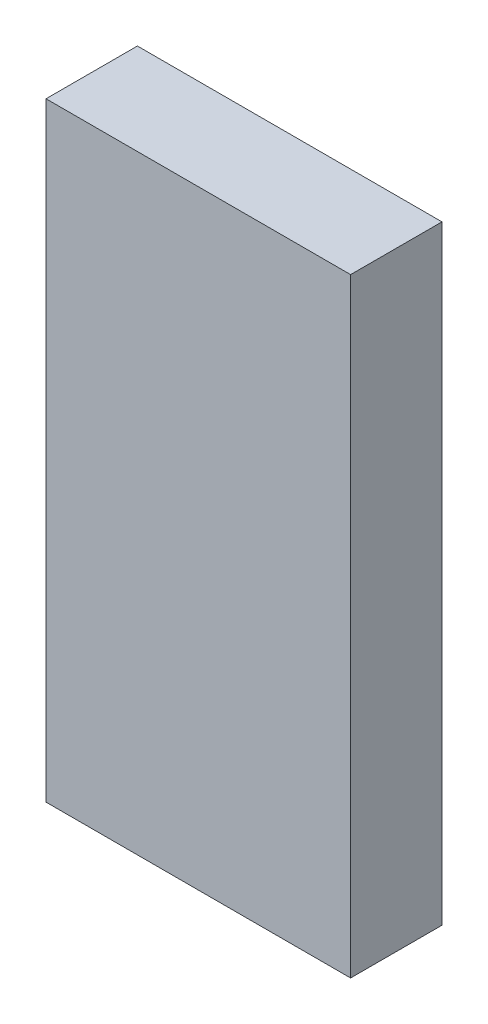
ISO-10303-21;
HEADER;
FILE_DESCRIPTION(('STEP AP214'),'2;1');
FILE_NAME('part.step','',(''),(''),'','','');
FILE_SCHEMA(('AUTOMOTIVE_DESIGN { 1 0 10303 214 1 1 1 1 }'));
ENDSEC;
DATA;
#1=APPLICATION_CONTEXT('core data for automotive mechanical design processes');
#2=APPLICATION_PROTOCOL_DEFINITION('international standard','automotive_design',2000,#1);
#3=PRODUCT_CONTEXT('',#1,'mechanical');
#4=PRODUCT('Part','Part','',(#3));
#5=PRODUCT_RELATED_PRODUCT_CATEGORY('part','',(#4));
#6=PRODUCT_DEFINITION_FORMATION('','',#4);
#7=PRODUCT_DEFINITION_CONTEXT('part definition',#1,'design');
#8=PRODUCT_DEFINITION('design','',#6,#7);
#9=PRODUCT_DEFINITION_SHAPE('','',#8);
#10=(LENGTH_UNIT() NAMED_UNIT(*) SI_UNIT(.MILLI.,.METRE.));
#11=(NAMED_UNIT(*) PLANE_ANGLE_UNIT() SI_UNIT($,.RADIAN.));
#12=(NAMED_UNIT(*) SI_UNIT($,.STERADIAN.) SOLID_ANGLE_UNIT());
#13=UNCERTAINTY_MEASURE_WITH_UNIT(LENGTH_MEASURE(1.E-05),#10,'distance_accuracy_value','');
#14=(GEOMETRIC_REPRESENTATION_CONTEXT(3) GLOBAL_UNCERTAINTY_ASSIGNED_CONTEXT((#13)) GLOBAL_UNIT_ASSIGNED_CONTEXT((#10,
#11,#12)) REPRESENTATION_CONTEXT('',''));
#15=CARTESIAN_POINT('',(0.,0.,0.));
#16=DIRECTION('',(0.,0.,1.));
#17=DIRECTION('',(1.,0.,0.));
#18=AXIS2_PLACEMENT_3D('',#15,#16,#17);
#19=CARTESIAN_POINT('',(-5.,20.,1.5));
#20=DIRECTION('',(1.,0.,0.));
#21=DIRECTION('',(0.,0.,-1.));
#22=AXIS2_PLACEMENT_3D('',#19,#20,#21);
#23=PLANE('',#22);
#24=DIRECTION('',(0.,0.,1.));
#25=VECTOR('',#24,1.);
#26=CARTESIAN_POINT('',(-5.,0.,1.5));
#27=LINE('',#26,#25);
#28=CARTESIAN_POINT('',(-5.,0.,-1.5));
#29=VERTEX_POINT('',#28);
#30=CARTESIAN_POINT('',(-5.,0.,1.5));
#31=VERTEX_POINT('',#30);
#32=EDGE_CURVE('E96',#29,#31,#27,.T.);
#33=ORIENTED_EDGE('',*,*,#32,.T.);
#34=DIRECTION('',(0.,-1.,0.));
#35=VECTOR('',#34,1.);
#36=CARTESIAN_POINT('',(-5.,20.,1.5));
#37=LINE('',#36,#35);
#38=CARTESIAN_POINT('',(-5.,20.,1.5));
#39=VERTEX_POINT('',#38);
#40=EDGE_CURVE('E11',#39,#31,#37,.T.);
#41=ORIENTED_EDGE('',*,*,#40,.F.);
#42=DIRECTION('',(0.,0.,1.));
#43=VECTOR('',#42,1.);
#44=CARTESIAN_POINT('',(-5.,20.,1.5));
#45=LINE('',#44,#43);
#46=CARTESIAN_POINT('',(-5.,20.,-1.5));
#47=VERTEX_POINT('',#46);
#48=EDGE_CURVE('E84',#47,#39,#45,.T.);
#49=ORIENTED_EDGE('',*,*,#48,.F.);
#50=DIRECTION('',(0.,-1.,0.));
#51=VECTOR('',#50,1.);
#52=CARTESIAN_POINT('',(-5.,20.,-1.5));
#53=LINE('',#52,#51);
#54=EDGE_CURVE('E92',#47,#29,#53,.T.);
#55=ORIENTED_EDGE('',*,*,#54,.T.);
#56=EDGE_LOOP('',(#33,#41,#49,#55));
#57=FACE_BOUND('',#56,.T.);
#58=ADVANCED_FACE('F33',(#57),#23,.F.);
#59=CARTESIAN_POINT('',(5.,20.,1.5));
#60=DIRECTION('',(0.,0.,-1.));
#61=DIRECTION('',(-1.,0.,0.));
#62=AXIS2_PLACEMENT_3D('',#59,#60,#61);
#63=PLANE('',#62);
#64=DIRECTION('',(1.,0.,0.));
#65=VECTOR('',#64,1.);
#66=CARTESIAN_POINT('',(5.,0.,1.5));
#67=LINE('',#66,#65);
#68=CARTESIAN_POINT('',(5.,0.,1.5));
#69=VERTEX_POINT('',#68);
#70=EDGE_CURVE('E88',#31,#69,#67,.T.);
#71=ORIENTED_EDGE('',*,*,#70,.T.);
#72=DIRECTION('',(0.,-1.,0.));
#73=VECTOR('',#72,1.);
#74=CARTESIAN_POINT('',(5.,20.,1.5));
#75=LINE('',#74,#73);
#76=CARTESIAN_POINT('',(5.,20.,1.5));
#77=VERTEX_POINT('',#76);
#78=EDGE_CURVE('E41',#77,#69,#75,.T.);
#79=ORIENTED_EDGE('',*,*,#78,.F.);
#80=DIRECTION('',(1.,0.,0.));
#81=VECTOR('',#80,1.);
#82=CARTESIAN_POINT('',(5.,20.,1.5));
#83=LINE('',#82,#81);
#84=EDGE_CURVE('E79',#39,#77,#83,.T.);
#85=ORIENTED_EDGE('',*,*,#84,.F.);
#86=ORIENTED_EDGE('',*,*,#40,.T.);
#87=EDGE_LOOP('',(#71,#79,#85,#86));
#88=FACE_BOUND('',#87,.T.);
#89=ADVANCED_FACE('F87',(#88),#63,.F.);
#90=CARTESIAN_POINT('',(5.,20.,1.5));
#91=DIRECTION('',(-1.,0.,0.));
#92=DIRECTION('',(0.,0.,1.));
#93=AXIS2_PLACEMENT_3D('',#90,#91,#92);
#94=PLANE('',#93);
#95=DIRECTION('',(0.,0.,-1.));
#96=VECTOR('',#95,1.);
#97=CARTESIAN_POINT('',(5.,0.,1.5));
#98=LINE('',#97,#96);
#99=CARTESIAN_POINT('',(5.,0.,-1.5));
#100=VERTEX_POINT('',#99);
#101=EDGE_CURVE('E66',#69,#100,#98,.T.);
#102=ORIENTED_EDGE('',*,*,#101,.T.);
#103=DIRECTION('',(0.,-1.,0.));
#104=VECTOR('',#103,1.);
#105=CARTESIAN_POINT('',(5.,20.,-1.5));
#106=LINE('',#105,#104);
#107=CARTESIAN_POINT('',(5.,20.,-1.5));
#108=VERTEX_POINT('',#107);
#109=EDGE_CURVE('E89',#108,#100,#106,.T.);
#110=ORIENTED_EDGE('',*,*,#109,.F.);
#111=DIRECTION('',(0.,0.,-1.));
#112=VECTOR('',#111,1.);
#113=CARTESIAN_POINT('',(5.,20.,1.5));
#114=LINE('',#113,#112);
#115=EDGE_CURVE('E82',#77,#108,#114,.T.);
#116=ORIENTED_EDGE('',*,*,#115,.F.);
#117=ORIENTED_EDGE('',*,*,#78,.T.);
#118=EDGE_LOOP('',(#102,#110,#116,#117));
#119=FACE_BOUND('',#118,.T.);
#120=ADVANCED_FACE('F90',(#119),#94,.F.);
#121=CARTESIAN_POINT('',(5.,20.,-1.5));
#122=DIRECTION('',(0.,0.,1.));
#123=DIRECTION('',(1.,0.,0.));
#124=AXIS2_PLACEMENT_3D('',#121,#122,#123);
#125=PLANE('',#124);
#126=DIRECTION('',(-1.,0.,0.));
#127=VECTOR('',#126,1.);
#128=CARTESIAN_POINT('',(5.,0.,-1.5));
#129=LINE('',#128,#127);
#130=EDGE_CURVE('E72',#100,#29,#129,.T.);
#131=ORIENTED_EDGE('',*,*,#130,.T.);
#132=ORIENTED_EDGE('',*,*,#54,.F.);
#133=DIRECTION('',(-1.,0.,0.));
#134=VECTOR('',#133,1.);
#135=CARTESIAN_POINT('',(5.,20.,-1.5));
#136=LINE('',#135,#134);
#137=EDGE_CURVE('E49',#108,#47,#136,.T.);
#138=ORIENTED_EDGE('',*,*,#137,.F.);
#139=ORIENTED_EDGE('',*,*,#109,.T.);
#140=EDGE_LOOP('',(#131,#132,#138,#139));
#141=FACE_BOUND('',#140,.T.);
#142=ADVANCED_FACE('F103',(#141),#125,.F.);
#143=CARTESIAN_POINT('',(0.,20.,0.));
#144=DIRECTION('',(0.,1.,0.));
#145=DIRECTION('',(0.,0.,1.));
#146=AXIS2_PLACEMENT_3D('',#143,#144,#145);
#147=PLANE('',#146);
#148=ORIENTED_EDGE('',*,*,#48,.T.);
#149=ORIENTED_EDGE('',*,*,#84,.T.);
#150=ORIENTED_EDGE('',*,*,#115,.T.);
#151=ORIENTED_EDGE('',*,*,#137,.T.);
#152=EDGE_LOOP('',(#148,#149,#150,#151));
#153=FACE_BOUND('',#152,.T.);
#154=ADVANCED_FACE('F80',(#153),#147,.T.);
#155=CARTESIAN_POINT('',(0.,0.,0.));
#156=DIRECTION('',(0.,1.,0.));
#157=DIRECTION('',(0.,0.,1.));
#158=AXIS2_PLACEMENT_3D('',#155,#156,#157);
#159=PLANE('',#158);
#160=ORIENTED_EDGE('',*,*,#32,.F.);
#161=ORIENTED_EDGE('',*,*,#130,.F.);
#162=ORIENTED_EDGE('',*,*,#101,.F.);
#163=ORIENTED_EDGE('',*,*,#70,.F.);
#164=EDGE_LOOP('',(#160,#161,#162,#163));
#165=FACE_BOUND('',#164,.T.);
#166=ADVANCED_FACE('F106',(#165),#159,.F.);
#167=CLOSED_SHELL('',(#58,#89,#120,#142,#154,#166));
#168=MANIFOLD_SOLID_BREP('B2',#167);
#169=ADVANCED_BREP_SHAPE_REPRESENTATION('',(#18,#168),#14);
#170=SHAPE_DEFINITION_REPRESENTATION(#9,#169);
ENDSEC;
END-ISO-10303-21;
